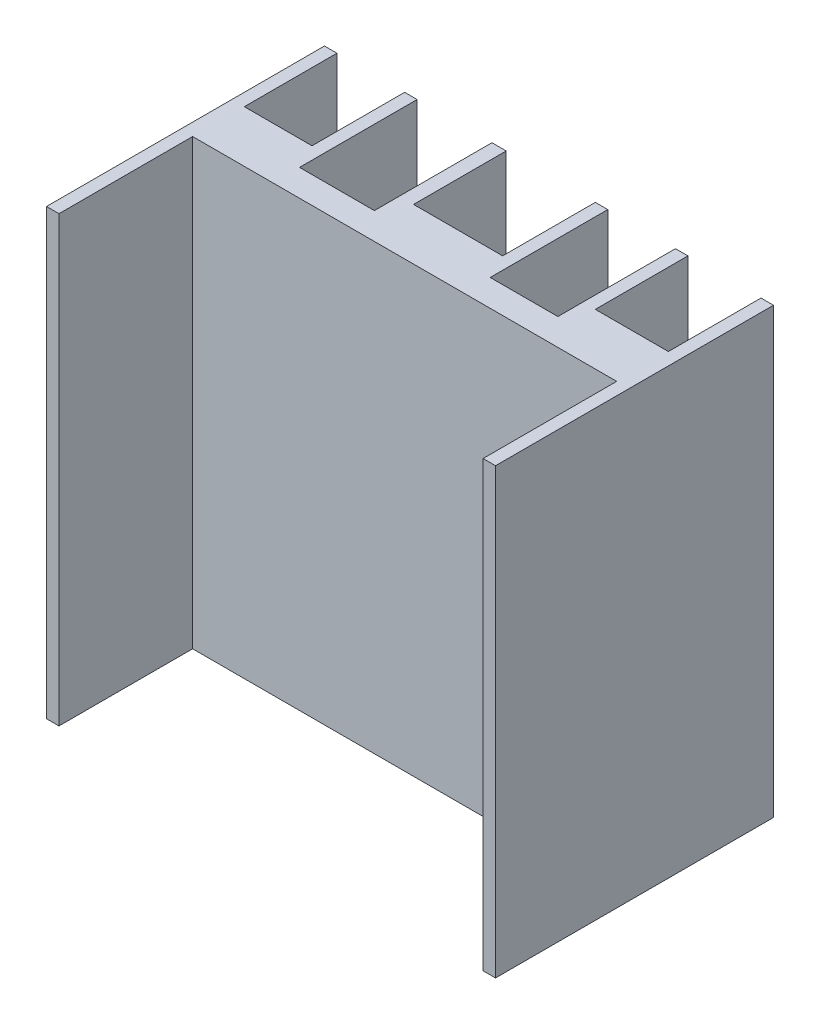
ISO-10303-21;
HEADER;
FILE_DESCRIPTION(('STEP AP214'),'2;1');
FILE_NAME('part.step','',(''),(''),'','','');
FILE_SCHEMA(('AUTOMOTIVE_DESIGN { 1 0 10303 214 1 1 1 1 }'));
ENDSEC;
DATA;
#1=APPLICATION_CONTEXT('core data for automotive mechanical design processes');
#2=APPLICATION_PROTOCOL_DEFINITION('international standard','automotive_design',2000,#1);
#3=PRODUCT_CONTEXT('',#1,'mechanical');
#4=PRODUCT('Part','Part','',(#3));
#5=PRODUCT_RELATED_PRODUCT_CATEGORY('part','',(#4));
#6=PRODUCT_DEFINITION_FORMATION('','',#4);
#7=PRODUCT_DEFINITION_CONTEXT('part definition',#1,'design');
#8=PRODUCT_DEFINITION('design','',#6,#7);
#9=PRODUCT_DEFINITION_SHAPE('','',#8);
#10=(LENGTH_UNIT() NAMED_UNIT(*) SI_UNIT(.MILLI.,.METRE.));
#11=(NAMED_UNIT(*) PLANE_ANGLE_UNIT() SI_UNIT($,.RADIAN.));
#12=(NAMED_UNIT(*) SI_UNIT($,.STERADIAN.) SOLID_ANGLE_UNIT());
#13=UNCERTAINTY_MEASURE_WITH_UNIT(LENGTH_MEASURE(1.E-05),#10,'distance_accuracy_value','');
#14=(GEOMETRIC_REPRESENTATION_CONTEXT(3) GLOBAL_UNCERTAINTY_ASSIGNED_CONTEXT((#13)) GLOBAL_UNIT_ASSIGNED_CONTEXT((#10,
#11,#12)) REPRESENTATION_CONTEXT('',''));
#15=CARTESIAN_POINT('',(0.,0.,0.));
#16=DIRECTION('',(0.,0.,1.));
#17=DIRECTION('',(1.,0.,0.));
#18=AXIS2_PLACEMENT_3D('',#15,#16,#17);
#19=CARTESIAN_POINT('',(2.6,24.9,-16.3));
#20=DIRECTION('',(1.,0.,0.));
#21=DIRECTION('',(0.,0.,-1.));
#22=AXIS2_PLACEMENT_3D('',#19,#20,#21);
#23=PLANE('',#22);
#24=DIRECTION('',(0.,0.,1.));
#25=VECTOR('',#24,1.);
#26=CARTESIAN_POINT('',(2.6,0.,-16.3));
#27=LINE('',#26,#25);
#28=CARTESIAN_POINT('',(2.6,0.,-21.5));
#29=VERTEX_POINT('',#28);
#30=CARTESIAN_POINT('',(2.6,0.,-16.3));
#31=VERTEX_POINT('',#30);
#32=EDGE_CURVE('E260',#29,#31,#27,.T.);
#33=ORIENTED_EDGE('',*,*,#32,.T.);
#34=DIRECTION('',(0.,-1.,0.));
#35=VECTOR('',#34,1.);
#36=CARTESIAN_POINT('',(2.6,24.9,-16.3));
#37=LINE('',#36,#35);
#38=CARTESIAN_POINT('',(2.6,24.9,-16.3));
#39=VERTEX_POINT('',#38);
#40=EDGE_CURVE('E11',#39,#31,#37,.T.);
#41=ORIENTED_EDGE('',*,*,#40,.F.);
#42=DIRECTION('',(0.,0.,1.));
#43=VECTOR('',#42,1.);
#44=CARTESIAN_POINT('',(2.6,24.9,-16.3));
#45=LINE('',#44,#43);
#46=CARTESIAN_POINT('',(2.6,24.9,-21.5));
#47=VERTEX_POINT('',#46);
#48=EDGE_CURVE('E342',#47,#39,#45,.T.);
#49=ORIENTED_EDGE('',*,*,#48,.F.);
#50=DIRECTION('',(0.,-1.,0.));
#51=VECTOR('',#50,1.);
#52=CARTESIAN_POINT('',(2.6,24.9,-21.5));
#53=LINE('',#52,#51);
#54=EDGE_CURVE('E256',#47,#29,#53,.T.);
#55=ORIENTED_EDGE('',*,*,#54,.T.);
#56=EDGE_LOOP('',(#33,#41,#49,#55));
#57=FACE_BOUND('',#56,.T.);
#58=ADVANCED_FACE('F39',(#57),#23,.F.);
#59=CARTESIAN_POINT('',(-2.4,24.9,-16.3));
#60=DIRECTION('',(0.,0.,1.));
#61=DIRECTION('',(1.,0.,0.));
#62=AXIS2_PLACEMENT_3D('',#59,#60,#61);
#63=PLANE('',#62);
#64=DIRECTION('',(-1.,0.,0.));
#65=VECTOR('',#64,1.);
#66=CARTESIAN_POINT('',(-2.4,0.,-16.3));
#67=LINE('',#66,#65);
#68=CARTESIAN_POINT('',(-2.4,0.,-16.3));
#69=VERTEX_POINT('',#68);
#70=EDGE_CURVE('E264',#31,#69,#67,.T.);
#71=ORIENTED_EDGE('',*,*,#70,.T.);
#72=DIRECTION('',(0.,-1.,0.));
#73=VECTOR('',#72,1.);
#74=CARTESIAN_POINT('',(-2.4,24.9,-16.3));
#75=LINE('',#74,#73);
#76=CARTESIAN_POINT('',(-2.4,24.9,-16.3));
#77=VERTEX_POINT('',#76);
#78=EDGE_CURVE('E48',#77,#69,#75,.T.);
#79=ORIENTED_EDGE('',*,*,#78,.F.);
#80=DIRECTION('',(-1.,0.,0.));
#81=VECTOR('',#80,1.);
#82=CARTESIAN_POINT('',(-2.4,24.9,-16.3));
#83=LINE('',#82,#81);
#84=EDGE_CURVE('E159',#39,#77,#83,.T.);
#85=ORIENTED_EDGE('',*,*,#84,.F.);
#86=ORIENTED_EDGE('',*,*,#40,.T.);
#87=EDGE_LOOP('',(#71,#79,#85,#86));
#88=FACE_BOUND('',#87,.T.);
#89=ADVANCED_FACE('F548',(#88),#63,.F.);
#90=CARTESIAN_POINT('',(-2.4,24.9,-21.5));
#91=DIRECTION('',(-1.,0.,0.));
#92=DIRECTION('',(0.,0.,1.));
#93=AXIS2_PLACEMENT_3D('',#90,#91,#92);
#94=PLANE('',#93);
#95=DIRECTION('',(0.,0.,-1.));
#96=VECTOR('',#95,1.);
#97=CARTESIAN_POINT('',(-2.4,0.,-21.5));
#98=LINE('',#97,#96);
#99=CARTESIAN_POINT('',(-2.4,0.,-21.5));
#100=VERTEX_POINT('',#99);
#101=EDGE_CURVE('E267',#69,#100,#98,.T.);
#102=ORIENTED_EDGE('',*,*,#101,.T.);
#103=DIRECTION('',(0.,-1.,0.));
#104=VECTOR('',#103,1.);
#105=CARTESIAN_POINT('',(-2.4,24.9,-21.5));
#106=LINE('',#105,#104);
#107=CARTESIAN_POINT('',(-2.4,24.9,-21.5));
#108=VERTEX_POINT('',#107);
#109=EDGE_CURVE('E433',#108,#100,#106,.T.);
#110=ORIENTED_EDGE('',*,*,#109,.F.);
#111=DIRECTION('',(0.,0.,-1.));
#112=VECTOR('',#111,1.);
#113=CARTESIAN_POINT('',(-2.4,24.9,-21.5));
#114=LINE('',#113,#112);
#115=EDGE_CURVE('E443',#77,#108,#114,.T.);
#116=ORIENTED_EDGE('',*,*,#115,.F.);
#117=ORIENTED_EDGE('',*,*,#78,.T.);
#118=EDGE_LOOP('',(#102,#110,#116,#117));
#119=FACE_BOUND('',#118,.T.);
#120=ADVANCED_FACE('F441',(#119),#94,.F.);
#121=CARTESIAN_POINT('',(-3.2,24.9,-21.5));
#122=DIRECTION('',(0.,0.,1.));
#123=DIRECTION('',(1.,0.,0.));
#124=AXIS2_PLACEMENT_3D('',#121,#122,#123);
#125=PLANE('',#124);
#126=DIRECTION('',(-1.,0.,0.));
#127=VECTOR('',#126,1.);
#128=CARTESIAN_POINT('',(-3.2,0.,-21.5));
#129=LINE('',#128,#127);
#130=CARTESIAN_POINT('',(-3.2,0.,-21.5));
#131=VERTEX_POINT('',#130);
#132=EDGE_CURVE('E270',#100,#131,#129,.T.);
#133=ORIENTED_EDGE('',*,*,#132,.T.);
#134=DIRECTION('',(0.,-1.,0.));
#135=VECTOR('',#134,1.);
#136=CARTESIAN_POINT('',(-3.2,24.9,-21.5));
#137=LINE('',#136,#135);
#138=CARTESIAN_POINT('',(-3.2,24.9,-21.5));
#139=VERTEX_POINT('',#138);
#140=EDGE_CURVE('E429',#139,#131,#137,.T.);
#141=ORIENTED_EDGE('',*,*,#140,.F.);
#142=DIRECTION('',(-1.,0.,0.));
#143=VECTOR('',#142,1.);
#144=CARTESIAN_POINT('',(-3.2,24.9,-21.5));
#145=LINE('',#144,#143);
#146=EDGE_CURVE('E462',#108,#139,#145,.T.);
#147=ORIENTED_EDGE('',*,*,#146,.F.);
#148=ORIENTED_EDGE('',*,*,#109,.T.);
#149=EDGE_LOOP('',(#133,#141,#147,#148));
#150=FACE_BOUND('',#149,.T.);
#151=ADVANCED_FACE('F452',(#150),#125,.F.);
#152=CARTESIAN_POINT('',(-3.2,24.9,-14.9));
#153=DIRECTION('',(1.,0.,0.));
#154=DIRECTION('',(0.,0.,-1.));
#155=AXIS2_PLACEMENT_3D('',#152,#153,#154);
#156=PLANE('',#155);
#157=DIRECTION('',(0.,0.,1.));
#158=VECTOR('',#157,1.);
#159=CARTESIAN_POINT('',(-3.2,0.,-14.9));
#160=LINE('',#159,#158);
#161=CARTESIAN_POINT('',(-3.2,0.,-14.9));
#162=VERTEX_POINT('',#161);
#163=EDGE_CURVE('E273',#131,#162,#160,.T.);
#164=ORIENTED_EDGE('',*,*,#163,.T.);
#165=DIRECTION('',(0.,-1.,0.));
#166=VECTOR('',#165,1.);
#167=CARTESIAN_POINT('',(-3.2,24.9,-14.9));
#168=LINE('',#167,#166);
#169=CARTESIAN_POINT('',(-3.2,24.9,-14.9));
#170=VERTEX_POINT('',#169);
#171=EDGE_CURVE('E425',#170,#162,#168,.T.);
#172=ORIENTED_EDGE('',*,*,#171,.F.);
#173=DIRECTION('',(0.,0.,1.));
#174=VECTOR('',#173,1.);
#175=CARTESIAN_POINT('',(-3.2,24.9,-14.9));
#176=LINE('',#175,#174);
#177=EDGE_CURVE('E458',#139,#170,#176,.T.);
#178=ORIENTED_EDGE('',*,*,#177,.F.);
#179=ORIENTED_EDGE('',*,*,#140,.T.);
#180=EDGE_LOOP('',(#164,#172,#178,#179));
#181=FACE_BOUND('',#180,.T.);
#182=ADVANCED_FACE('F456',(#181),#156,.F.);
#183=CARTESIAN_POINT('',(-7.4,24.9,-14.9));
#184=DIRECTION('',(0.,0.,1.));
#185=DIRECTION('',(1.,0.,0.));
#186=AXIS2_PLACEMENT_3D('',#183,#184,#185);
#187=PLANE('',#186);
#188=DIRECTION('',(-1.,0.,0.));
#189=VECTOR('',#188,1.);
#190=CARTESIAN_POINT('',(-7.4,0.,-14.9));
#191=LINE('',#190,#189);
#192=CARTESIAN_POINT('',(-7.4,0.,-14.9));
#193=VERTEX_POINT('',#192);
#194=EDGE_CURVE('E276',#162,#193,#191,.T.);
#195=ORIENTED_EDGE('',*,*,#194,.T.);
#196=DIRECTION('',(0.,-1.,0.));
#197=VECTOR('',#196,1.);
#198=CARTESIAN_POINT('',(-7.4,24.9,-14.9));
#199=LINE('',#198,#197);
#200=CARTESIAN_POINT('',(-7.4,24.9,-14.9));
#201=VERTEX_POINT('',#200);
#202=EDGE_CURVE('E421',#201,#193,#199,.T.);
#203=ORIENTED_EDGE('',*,*,#202,.F.);
#204=DIRECTION('',(-1.,0.,0.));
#205=VECTOR('',#204,1.);
#206=CARTESIAN_POINT('',(-7.4,24.9,-14.9));
#207=LINE('',#206,#205);
#208=EDGE_CURVE('E461',#170,#201,#207,.T.);
#209=ORIENTED_EDGE('',*,*,#208,.F.);
#210=ORIENTED_EDGE('',*,*,#171,.T.);
#211=EDGE_LOOP('',(#195,#203,#209,#210));
#212=FACE_BOUND('',#211,.T.);
#213=ADVANCED_FACE('F561',(#212),#187,.F.);
#214=CARTESIAN_POINT('',(-7.4,24.9,-21.5));
#215=DIRECTION('',(-1.,0.,0.));
#216=DIRECTION('',(0.,0.,1.));
#217=AXIS2_PLACEMENT_3D('',#214,#215,#216);
#218=PLANE('',#217);
#219=DIRECTION('',(0.,0.,-1.));
#220=VECTOR('',#219,1.);
#221=CARTESIAN_POINT('',(-7.4,0.,-21.5));
#222=LINE('',#221,#220);
#223=CARTESIAN_POINT('',(-7.4,0.,-21.5));
#224=VERTEX_POINT('',#223);
#225=EDGE_CURVE('E279',#193,#224,#222,.T.);
#226=ORIENTED_EDGE('',*,*,#225,.T.);
#227=DIRECTION('',(0.,-1.,0.));
#228=VECTOR('',#227,1.);
#229=CARTESIAN_POINT('',(-7.4,24.9,-21.5));
#230=LINE('',#229,#228);
#231=CARTESIAN_POINT('',(-7.4,24.9,-21.5));
#232=VERTEX_POINT('',#231);
#233=EDGE_CURVE('E417',#232,#224,#230,.T.);
#234=ORIENTED_EDGE('',*,*,#233,.F.);
#235=DIRECTION('',(0.,0.,-1.));
#236=VECTOR('',#235,1.);
#237=CARTESIAN_POINT('',(-7.4,24.9,-21.5));
#238=LINE('',#237,#236);
#239=EDGE_CURVE('E466',#201,#232,#238,.T.);
#240=ORIENTED_EDGE('',*,*,#239,.F.);
#241=ORIENTED_EDGE('',*,*,#202,.T.);
#242=EDGE_LOOP('',(#226,#234,#240,#241));
#243=FACE_BOUND('',#242,.T.);
#244=ADVANCED_FACE('F564',(#243),#218,.F.);
#245=CARTESIAN_POINT('',(-8.1,24.9,-21.5));
#246=DIRECTION('',(0.,0.,1.));
#247=DIRECTION('',(1.,0.,0.));
#248=AXIS2_PLACEMENT_3D('',#245,#246,#247);
#249=PLANE('',#248);
#250=DIRECTION('',(-1.,0.,0.));
#251=VECTOR('',#250,1.);
#252=CARTESIAN_POINT('',(-8.1,0.,-21.5));
#253=LINE('',#252,#251);
#254=CARTESIAN_POINT('',(-8.1,0.,-21.5));
#255=VERTEX_POINT('',#254);
#256=EDGE_CURVE('E282',#224,#255,#253,.T.);
#257=ORIENTED_EDGE('',*,*,#256,.T.);
#258=DIRECTION('',(0.,-1.,0.));
#259=VECTOR('',#258,1.);
#260=CARTESIAN_POINT('',(-8.1,24.9,-21.5));
#261=LINE('',#260,#259);
#262=CARTESIAN_POINT('',(-8.1,24.9,-21.5));
#263=VERTEX_POINT('',#262);
#264=EDGE_CURVE('E413',#263,#255,#261,.T.);
#265=ORIENTED_EDGE('',*,*,#264,.F.);
#266=DIRECTION('',(-1.,0.,0.));
#267=VECTOR('',#266,1.);
#268=CARTESIAN_POINT('',(-8.1,24.9,-21.5));
#269=LINE('',#268,#267);
#270=EDGE_CURVE('E473',#232,#263,#269,.T.);
#271=ORIENTED_EDGE('',*,*,#270,.F.);
#272=ORIENTED_EDGE('',*,*,#233,.T.);
#273=EDGE_LOOP('',(#257,#265,#271,#272));
#274=FACE_BOUND('',#273,.T.);
#275=ADVANCED_FACE('F568',(#274),#249,.F.);
#276=CARTESIAN_POINT('',(-8.1,24.9,-16.3));
#277=DIRECTION('',(1.,0.,0.));
#278=DIRECTION('',(0.,0.,-1.));
#279=AXIS2_PLACEMENT_3D('',#276,#277,#278);
#280=PLANE('',#279);
#281=DIRECTION('',(0.,0.,1.));
#282=VECTOR('',#281,1.);
#283=CARTESIAN_POINT('',(-8.1,0.,-16.3));
#284=LINE('',#283,#282);
#285=CARTESIAN_POINT('',(-8.1,0.,-16.3));
#286=VERTEX_POINT('',#285);
#287=EDGE_CURVE('E285',#255,#286,#284,.T.);
#288=ORIENTED_EDGE('',*,*,#287,.T.);
#289=DIRECTION('',(0.,-1.,0.));
#290=VECTOR('',#289,1.);
#291=CARTESIAN_POINT('',(-8.1,24.9,-16.3));
#292=LINE('',#291,#290);
#293=CARTESIAN_POINT('',(-8.1,24.9,-16.3));
#294=VERTEX_POINT('',#293);
#295=EDGE_CURVE('E409',#294,#286,#292,.T.);
#296=ORIENTED_EDGE('',*,*,#295,.F.);
#297=DIRECTION('',(0.,0.,1.));
#298=VECTOR('',#297,1.);
#299=CARTESIAN_POINT('',(-8.1,24.9,-16.3));
#300=LINE('',#299,#298);
#301=EDGE_CURVE('E476',#263,#294,#300,.T.);
#302=ORIENTED_EDGE('',*,*,#301,.F.);
#303=ORIENTED_EDGE('',*,*,#264,.T.);
#304=EDGE_LOOP('',(#288,#296,#302,#303));
#305=FACE_BOUND('',#304,.T.);
#306=ADVANCED_FACE('F572',(#305),#280,.F.);
#307=CARTESIAN_POINT('',(-11.9,24.9,-16.3));
#308=DIRECTION('',(0.,0.,1.));
#309=DIRECTION('',(1.,0.,0.));
#310=AXIS2_PLACEMENT_3D('',#307,#308,#309);
#311=PLANE('',#310);
#312=DIRECTION('',(-1.,0.,0.));
#313=VECTOR('',#312,1.);
#314=CARTESIAN_POINT('',(-11.9,0.,-16.3));
#315=LINE('',#314,#313);
#316=CARTESIAN_POINT('',(-11.9,0.,-16.3));
#317=VERTEX_POINT('',#316);
#318=EDGE_CURVE('E288',#286,#317,#315,.T.);
#319=ORIENTED_EDGE('',*,*,#318,.T.);
#320=DIRECTION('',(0.,-1.,0.));
#321=VECTOR('',#320,1.);
#322=CARTESIAN_POINT('',(-11.9,24.9,-16.3));
#323=LINE('',#322,#321);
#324=CARTESIAN_POINT('',(-11.9,24.9,-16.3));
#325=VERTEX_POINT('',#324);
#326=EDGE_CURVE('E405',#325,#317,#323,.T.);
#327=ORIENTED_EDGE('',*,*,#326,.F.);
#328=DIRECTION('',(-1.,0.,0.));
#329=VECTOR('',#328,1.);
#330=CARTESIAN_POINT('',(-11.9,24.9,-16.3));
#331=LINE('',#330,#329);
#332=EDGE_CURVE('E479',#294,#325,#331,.T.);
#333=ORIENTED_EDGE('',*,*,#332,.F.);
#334=ORIENTED_EDGE('',*,*,#295,.T.);
#335=EDGE_LOOP('',(#319,#327,#333,#334));
#336=FACE_BOUND('',#335,.T.);
#337=ADVANCED_FACE('F576',(#336),#311,.F.);
#338=CARTESIAN_POINT('',(-11.9,24.9,-21.5));
#339=DIRECTION('',(-1.,0.,0.));
#340=DIRECTION('',(0.,0.,1.));
#341=AXIS2_PLACEMENT_3D('',#338,#339,#340);
#342=PLANE('',#341);
#343=DIRECTION('',(0.,0.,-1.));
#344=VECTOR('',#343,1.);
#345=CARTESIAN_POINT('',(-11.9,0.,-21.5));
#346=LINE('',#345,#344);
#347=CARTESIAN_POINT('',(-11.9,0.,-21.5));
#348=VERTEX_POINT('',#347);
#349=EDGE_CURVE('E291',#317,#348,#346,.T.);
#350=ORIENTED_EDGE('',*,*,#349,.T.);
#351=DIRECTION('',(0.,-1.,0.));
#352=VECTOR('',#351,1.);
#353=CARTESIAN_POINT('',(-11.9,24.9,-21.5));
#354=LINE('',#353,#352);
#355=CARTESIAN_POINT('',(-11.9,24.9,-21.5));
#356=VERTEX_POINT('',#355);
#357=EDGE_CURVE('E401',#356,#348,#354,.T.);
#358=ORIENTED_EDGE('',*,*,#357,.F.);
#359=DIRECTION('',(0.,0.,-1.));
#360=VECTOR('',#359,1.);
#361=CARTESIAN_POINT('',(-11.9,24.9,-21.5));
#362=LINE('',#361,#360);
#363=EDGE_CURVE('E482',#325,#356,#362,.T.);
#364=ORIENTED_EDGE('',*,*,#363,.F.);
#365=ORIENTED_EDGE('',*,*,#326,.T.);
#366=EDGE_LOOP('',(#350,#358,#364,#365));
#367=FACE_BOUND('',#366,.T.);
#368=ADVANCED_FACE('F580',(#367),#342,.F.);
#369=CARTESIAN_POINT('',(-12.6,24.9,-21.5));
#370=DIRECTION('',(0.,0.,1.));
#371=DIRECTION('',(1.,0.,0.));
#372=AXIS2_PLACEMENT_3D('',#369,#370,#371);
#373=PLANE('',#372);
#374=DIRECTION('',(-1.,0.,0.));
#375=VECTOR('',#374,1.);
#376=CARTESIAN_POINT('',(-12.6,0.,-21.5));
#377=LINE('',#376,#375);
#378=CARTESIAN_POINT('',(-12.6,0.,-21.5));
#379=VERTEX_POINT('',#378);
#380=EDGE_CURVE('E294',#348,#379,#377,.T.);
#381=ORIENTED_EDGE('',*,*,#380,.T.);
#382=DIRECTION('',(0.,-1.,0.));
#383=VECTOR('',#382,1.);
#384=CARTESIAN_POINT('',(-12.6,24.9,-21.5));
#385=LINE('',#384,#383);
#386=CARTESIAN_POINT('',(-12.6,24.9,-21.5));
#387=VERTEX_POINT('',#386);
#388=EDGE_CURVE('E397',#387,#379,#385,.T.);
#389=ORIENTED_EDGE('',*,*,#388,.F.);
#390=DIRECTION('',(-1.,0.,0.));
#391=VECTOR('',#390,1.);
#392=CARTESIAN_POINT('',(-12.6,24.9,-21.5));
#393=LINE('',#392,#391);
#394=EDGE_CURVE('E485',#356,#387,#393,.T.);
#395=ORIENTED_EDGE('',*,*,#394,.F.);
#396=ORIENTED_EDGE('',*,*,#357,.T.);
#397=EDGE_LOOP('',(#381,#389,#395,#396));
#398=FACE_BOUND('',#397,.T.);
#399=ADVANCED_FACE('F584',(#398),#373,.F.);
#400=CARTESIAN_POINT('',(-12.6,24.9,-21.5));
#401=DIRECTION('',(1.,0.,0.));
#402=DIRECTION('',(0.,0.,-1.));
#403=AXIS2_PLACEMENT_3D('',#400,#401,#402);
#404=PLANE('',#403);
#405=DIRECTION('',(0.,0.,1.));
#406=VECTOR('',#405,1.);
#407=CARTESIAN_POINT('',(-12.6,0.,-21.5));
#408=LINE('',#407,#406);
#409=CARTESIAN_POINT('',(-12.6,0.,-5.9));
#410=VERTEX_POINT('',#409);
#411=EDGE_CURVE('E297',#379,#410,#408,.T.);
#412=ORIENTED_EDGE('',*,*,#411,.T.);
#413=DIRECTION('',(0.,-1.,0.));
#414=VECTOR('',#413,1.);
#415=CARTESIAN_POINT('',(-12.6,24.9,-5.9));
#416=LINE('',#415,#414);
#417=CARTESIAN_POINT('',(-12.6,24.9,-5.9));
#418=VERTEX_POINT('',#417);
#419=EDGE_CURVE('E393',#418,#410,#416,.T.);
#420=ORIENTED_EDGE('',*,*,#419,.F.);
#421=DIRECTION('',(0.,0.,1.));
#422=VECTOR('',#421,1.);
#423=CARTESIAN_POINT('',(-12.6,24.9,-21.5));
#424=LINE('',#423,#422);
#425=EDGE_CURVE('E488',#387,#418,#424,.T.);
#426=ORIENTED_EDGE('',*,*,#425,.F.);
#427=ORIENTED_EDGE('',*,*,#388,.T.);
#428=EDGE_LOOP('',(#412,#420,#426,#427));
#429=FACE_BOUND('',#428,.T.);
#430=ADVANCED_FACE('F588',(#429),#404,.F.);
#431=CARTESIAN_POINT('',(-11.9,24.9,-5.9));
#432=DIRECTION('',(0.,0.,-1.));
#433=DIRECTION('',(-1.,0.,0.));
#434=AXIS2_PLACEMENT_3D('',#431,#432,#433);
#435=PLANE('',#434);
#436=DIRECTION('',(1.,0.,0.));
#437=VECTOR('',#436,1.);
#438=CARTESIAN_POINT('',(-11.9,0.,-5.9));
#439=LINE('',#438,#437);
#440=CARTESIAN_POINT('',(-11.9,0.,-5.9));
#441=VERTEX_POINT('',#440);
#442=EDGE_CURVE('E300',#410,#441,#439,.T.);
#443=ORIENTED_EDGE('',*,*,#442,.T.);
#444=DIRECTION('',(0.,-1.,0.));
#445=VECTOR('',#444,1.);
#446=CARTESIAN_POINT('',(-11.9,24.9,-5.9));
#447=LINE('',#446,#445);
#448=CARTESIAN_POINT('',(-11.9,24.9,-5.9));
#449=VERTEX_POINT('',#448);
#450=EDGE_CURVE('E389',#449,#441,#447,.T.);
#451=ORIENTED_EDGE('',*,*,#450,.F.);
#452=DIRECTION('',(1.,0.,0.));
#453=VECTOR('',#452,1.);
#454=CARTESIAN_POINT('',(-11.9,24.9,-5.9));
#455=LINE('',#454,#453);
#456=EDGE_CURVE('E491',#418,#449,#455,.T.);
#457=ORIENTED_EDGE('',*,*,#456,.F.);
#458=ORIENTED_EDGE('',*,*,#419,.T.);
#459=EDGE_LOOP('',(#443,#451,#457,#458));
#460=FACE_BOUND('',#459,.T.);
#461=ADVANCED_FACE('F592',(#460),#435,.F.);
#462=CARTESIAN_POINT('',(-11.9,24.9,-5.9));
#463=DIRECTION('',(-1.,0.,0.));
#464=DIRECTION('',(0.,0.,1.));
#465=AXIS2_PLACEMENT_3D('',#462,#463,#464);
#466=PLANE('',#465);
#467=DIRECTION('',(0.,0.,-1.));
#468=VECTOR('',#467,1.);
#469=CARTESIAN_POINT('',(-11.9,0.,-5.9));
#470=LINE('',#469,#468);
#471=CARTESIAN_POINT('',(-11.9,0.,-13.4));
#472=VERTEX_POINT('',#471);
#473=EDGE_CURVE('E303',#441,#472,#470,.T.);
#474=ORIENTED_EDGE('',*,*,#473,.T.);
#475=DIRECTION('',(0.,-1.,0.));
#476=VECTOR('',#475,1.);
#477=CARTESIAN_POINT('',(-11.9,24.9,-13.4));
#478=LINE('',#477,#476);
#479=CARTESIAN_POINT('',(-11.9,24.9,-13.4));
#480=VERTEX_POINT('',#479);
#481=EDGE_CURVE('E385',#480,#472,#478,.T.);
#482=ORIENTED_EDGE('',*,*,#481,.F.);
#483=DIRECTION('',(0.,0.,-1.));
#484=VECTOR('',#483,1.);
#485=CARTESIAN_POINT('',(-11.9,24.9,-5.9));
#486=LINE('',#485,#484);
#487=EDGE_CURVE('E494',#449,#480,#486,.T.);
#488=ORIENTED_EDGE('',*,*,#487,.F.);
#489=ORIENTED_EDGE('',*,*,#450,.T.);
#490=EDGE_LOOP('',(#474,#482,#488,#489));
#491=FACE_BOUND('',#490,.T.);
#492=ADVANCED_FACE('F596',(#491),#466,.F.);
#493=CARTESIAN_POINT('',(-11.9,24.9,-13.4));
#494=DIRECTION('',(0.,0.,-1.));
#495=DIRECTION('',(-1.,0.,0.));
#496=AXIS2_PLACEMENT_3D('',#493,#494,#495);
#497=PLANE('',#496);
#498=DIRECTION('',(1.,0.,0.));
#499=VECTOR('',#498,1.);
#500=CARTESIAN_POINT('',(-11.9,0.,-13.4));
#501=LINE('',#500,#499);
#502=CARTESIAN_POINT('',(11.9,0.,-13.4));
#503=VERTEX_POINT('',#502);
#504=EDGE_CURVE('E306',#472,#503,#501,.T.);
#505=ORIENTED_EDGE('',*,*,#504,.T.);
#506=DIRECTION('',(0.,-1.,0.));
#507=VECTOR('',#506,1.);
#508=CARTESIAN_POINT('',(11.9,24.9,-13.4));
#509=LINE('',#508,#507);
#510=CARTESIAN_POINT('',(11.9,24.9,-13.4));
#511=VERTEX_POINT('',#510);
#512=EDGE_CURVE('E381',#511,#503,#509,.T.);
#513=ORIENTED_EDGE('',*,*,#512,.F.);
#514=DIRECTION('',(1.,0.,0.));
#515=VECTOR('',#514,1.);
#516=CARTESIAN_POINT('',(-11.9,24.9,-13.4));
#517=LINE('',#516,#515);
#518=EDGE_CURVE('E497',#480,#511,#517,.T.);
#519=ORIENTED_EDGE('',*,*,#518,.F.);
#520=ORIENTED_EDGE('',*,*,#481,.T.);
#521=EDGE_LOOP('',(#505,#513,#519,#520));
#522=FACE_BOUND('',#521,.T.);
#523=ADVANCED_FACE('F600',(#522),#497,.F.);
#524=CARTESIAN_POINT('',(11.9,24.9,-13.4));
#525=DIRECTION('',(1.,0.,0.));
#526=DIRECTION('',(0.,0.,-1.));
#527=AXIS2_PLACEMENT_3D('',#524,#525,#526);
#528=PLANE('',#527);
#529=DIRECTION('',(0.,0.,1.));
#530=VECTOR('',#529,1.);
#531=CARTESIAN_POINT('',(11.9,0.,-13.4));
#532=LINE('',#531,#530);
#533=CARTESIAN_POINT('',(11.9,0.,-5.9));
#534=VERTEX_POINT('',#533);
#535=EDGE_CURVE('E309',#503,#534,#532,.T.);
#536=ORIENTED_EDGE('',*,*,#535,.T.);
#537=DIRECTION('',(0.,-1.,0.));
#538=VECTOR('',#537,1.);
#539=CARTESIAN_POINT('',(11.9,24.9,-5.9));
#540=LINE('',#539,#538);
#541=CARTESIAN_POINT('',(11.9,24.9,-5.9));
#542=VERTEX_POINT('',#541);
#543=EDGE_CURVE('E377',#542,#534,#540,.T.);
#544=ORIENTED_EDGE('',*,*,#543,.F.);
#545=DIRECTION('',(0.,0.,1.));
#546=VECTOR('',#545,1.);
#547=CARTESIAN_POINT('',(11.9,24.9,-13.4));
#548=LINE('',#547,#546);
#549=EDGE_CURVE('E500',#511,#542,#548,.T.);
#550=ORIENTED_EDGE('',*,*,#549,.F.);
#551=ORIENTED_EDGE('',*,*,#512,.T.);
#552=EDGE_LOOP('',(#536,#544,#550,#551));
#553=FACE_BOUND('',#552,.T.);
#554=ADVANCED_FACE('F604',(#553),#528,.F.);
#555=CARTESIAN_POINT('',(11.9,24.9,-5.9));
#556=DIRECTION('',(0.,0.,-1.));
#557=DIRECTION('',(-1.,0.,0.));
#558=AXIS2_PLACEMENT_3D('',#555,#556,#557);
#559=PLANE('',#558);
#560=DIRECTION('',(1.,0.,0.));
#561=VECTOR('',#560,1.);
#562=CARTESIAN_POINT('',(11.9,0.,-5.9));
#563=LINE('',#562,#561);
#564=CARTESIAN_POINT('',(12.6,0.,-5.9));
#565=VERTEX_POINT('',#564);
#566=EDGE_CURVE('E312',#534,#565,#563,.T.);
#567=ORIENTED_EDGE('',*,*,#566,.T.);
#568=DIRECTION('',(0.,-1.,0.));
#569=VECTOR('',#568,1.);
#570=CARTESIAN_POINT('',(12.6,24.9,-5.9));
#571=LINE('',#570,#569);
#572=CARTESIAN_POINT('',(12.6,24.9,-5.9));
#573=VERTEX_POINT('',#572);
#574=EDGE_CURVE('E373',#573,#565,#571,.T.);
#575=ORIENTED_EDGE('',*,*,#574,.F.);
#576=DIRECTION('',(1.,0.,0.));
#577=VECTOR('',#576,1.);
#578=CARTESIAN_POINT('',(11.9,24.9,-5.9));
#579=LINE('',#578,#577);
#580=EDGE_CURVE('E503',#542,#573,#579,.T.);
#581=ORIENTED_EDGE('',*,*,#580,.F.);
#582=ORIENTED_EDGE('',*,*,#543,.T.);
#583=EDGE_LOOP('',(#567,#575,#581,#582));
#584=FACE_BOUND('',#583,.T.);
#585=ADVANCED_FACE('F608',(#584),#559,.F.);
#586=CARTESIAN_POINT('',(12.6,24.9,-5.9));
#587=DIRECTION('',(-1.,0.,0.));
#588=DIRECTION('',(0.,0.,1.));
#589=AXIS2_PLACEMENT_3D('',#586,#587,#588);
#590=PLANE('',#589);
#591=DIRECTION('',(0.,0.,-1.));
#592=VECTOR('',#591,1.);
#593=CARTESIAN_POINT('',(12.6,0.,-5.9));
#594=LINE('',#593,#592);
#595=CARTESIAN_POINT('',(12.6,0.,-21.5));
#596=VERTEX_POINT('',#595);
#597=EDGE_CURVE('E315',#565,#596,#594,.T.);
#598=ORIENTED_EDGE('',*,*,#597,.T.);
#599=DIRECTION('',(0.,-1.,0.));
#600=VECTOR('',#599,1.);
#601=CARTESIAN_POINT('',(12.6,24.9,-21.5));
#602=LINE('',#601,#600);
#603=CARTESIAN_POINT('',(12.6,24.9,-21.5));
#604=VERTEX_POINT('',#603);
#605=EDGE_CURVE('E369',#604,#596,#602,.T.);
#606=ORIENTED_EDGE('',*,*,#605,.F.);
#607=DIRECTION('',(0.,0.,-1.));
#608=VECTOR('',#607,1.);
#609=CARTESIAN_POINT('',(12.6,24.9,-5.9));
#610=LINE('',#609,#608);
#611=EDGE_CURVE('E506',#573,#604,#610,.T.);
#612=ORIENTED_EDGE('',*,*,#611,.F.);
#613=ORIENTED_EDGE('',*,*,#574,.T.);
#614=EDGE_LOOP('',(#598,#606,#612,#613));
#615=FACE_BOUND('',#614,.T.);
#616=ADVANCED_FACE('F612',(#615),#590,.F.);
#617=CARTESIAN_POINT('',(11.9,24.9,-21.5));
#618=DIRECTION('',(0.,0.,1.));
#619=DIRECTION('',(1.,0.,0.));
#620=AXIS2_PLACEMENT_3D('',#617,#618,#619);
#621=PLANE('',#620);
#622=DIRECTION('',(-1.,0.,0.));
#623=VECTOR('',#622,1.);
#624=CARTESIAN_POINT('',(11.9,0.,-21.5));
#625=LINE('',#624,#623);
#626=CARTESIAN_POINT('',(11.9,0.,-21.5));
#627=VERTEX_POINT('',#626);
#628=EDGE_CURVE('E318',#596,#627,#625,.T.);
#629=ORIENTED_EDGE('',*,*,#628,.T.);
#630=DIRECTION('',(0.,-1.,0.));
#631=VECTOR('',#630,1.);
#632=CARTESIAN_POINT('',(11.9,24.9,-21.5));
#633=LINE('',#632,#631);
#634=CARTESIAN_POINT('',(11.9,24.9,-21.5));
#635=VERTEX_POINT('',#634);
#636=EDGE_CURVE('E365',#635,#627,#633,.T.);
#637=ORIENTED_EDGE('',*,*,#636,.F.);
#638=DIRECTION('',(-1.,0.,0.));
#639=VECTOR('',#638,1.);
#640=CARTESIAN_POINT('',(11.9,24.9,-21.5));
#641=LINE('',#640,#639);
#642=EDGE_CURVE('E509',#604,#635,#641,.T.);
#643=ORIENTED_EDGE('',*,*,#642,.F.);
#644=ORIENTED_EDGE('',*,*,#605,.T.);
#645=EDGE_LOOP('',(#629,#637,#643,#644));
#646=FACE_BOUND('',#645,.T.);
#647=ADVANCED_FACE('F616',(#646),#621,.F.);
#648=CARTESIAN_POINT('',(11.9,24.9,-16.3));
#649=DIRECTION('',(1.,0.,0.));
#650=DIRECTION('',(0.,0.,-1.));
#651=AXIS2_PLACEMENT_3D('',#648,#649,#650);
#652=PLANE('',#651);
#653=DIRECTION('',(0.,0.,1.));
#654=VECTOR('',#653,1.);
#655=CARTESIAN_POINT('',(11.9,0.,-16.3));
#656=LINE('',#655,#654);
#657=CARTESIAN_POINT('',(11.9,0.,-16.3));
#658=VERTEX_POINT('',#657);
#659=EDGE_CURVE('E321',#627,#658,#656,.T.);
#660=ORIENTED_EDGE('',*,*,#659,.T.);
#661=DIRECTION('',(0.,-1.,0.));
#662=VECTOR('',#661,1.);
#663=CARTESIAN_POINT('',(11.9,24.9,-16.3));
#664=LINE('',#663,#662);
#665=CARTESIAN_POINT('',(11.9,24.9,-16.3));
#666=VERTEX_POINT('',#665);
#667=EDGE_CURVE('E361',#666,#658,#664,.T.);
#668=ORIENTED_EDGE('',*,*,#667,.F.);
#669=DIRECTION('',(0.,0.,1.));
#670=VECTOR('',#669,1.);
#671=CARTESIAN_POINT('',(11.9,24.9,-16.3));
#672=LINE('',#671,#670);
#673=EDGE_CURVE('E512',#635,#666,#672,.T.);
#674=ORIENTED_EDGE('',*,*,#673,.F.);
#675=ORIENTED_EDGE('',*,*,#636,.T.);
#676=EDGE_LOOP('',(#660,#668,#674,#675));
#677=FACE_BOUND('',#676,.T.);
#678=ADVANCED_FACE('F620',(#677),#652,.F.);
#679=CARTESIAN_POINT('',(11.9,24.9,-16.3));
#680=DIRECTION('',(0.,0.,1.));
#681=DIRECTION('',(1.,0.,0.));
#682=AXIS2_PLACEMENT_3D('',#679,#680,#681);
#683=PLANE('',#682);
#684=DIRECTION('',(-1.,0.,0.));
#685=VECTOR('',#684,1.);
#686=CARTESIAN_POINT('',(11.9,0.,-16.3));
#687=LINE('',#686,#685);
#688=CARTESIAN_POINT('',(7.8,0.,-16.3));
#689=VERTEX_POINT('',#688);
#690=EDGE_CURVE('E324',#658,#689,#687,.T.);
#691=ORIENTED_EDGE('',*,*,#690,.T.);
#692=DIRECTION('',(0.,-1.,0.));
#693=VECTOR('',#692,1.);
#694=CARTESIAN_POINT('',(7.8,24.9,-16.3));
#695=LINE('',#694,#693);
#696=CARTESIAN_POINT('',(7.8,24.9,-16.3));
#697=VERTEX_POINT('',#696);
#698=EDGE_CURVE('E357',#697,#689,#695,.T.);
#699=ORIENTED_EDGE('',*,*,#698,.F.);
#700=DIRECTION('',(-1.,0.,0.));
#701=VECTOR('',#700,1.);
#702=CARTESIAN_POINT('',(11.9,24.9,-16.3));
#703=LINE('',#702,#701);
#704=EDGE_CURVE('E515',#666,#697,#703,.T.);
#705=ORIENTED_EDGE('',*,*,#704,.F.);
#706=ORIENTED_EDGE('',*,*,#667,.T.);
#707=EDGE_LOOP('',(#691,#699,#705,#706));
#708=FACE_BOUND('',#707,.T.);
#709=ADVANCED_FACE('F624',(#708),#683,.F.);
#710=CARTESIAN_POINT('',(7.8,24.9,-21.5));
#711=DIRECTION('',(-1.,0.,0.));
#712=DIRECTION('',(0.,0.,1.));
#713=AXIS2_PLACEMENT_3D('',#710,#711,#712);
#714=PLANE('',#713);
#715=DIRECTION('',(0.,0.,-1.));
#716=VECTOR('',#715,1.);
#717=CARTESIAN_POINT('',(7.8,0.,-21.5));
#718=LINE('',#717,#716);
#719=CARTESIAN_POINT('',(7.8,0.,-21.5));
#720=VERTEX_POINT('',#719);
#721=EDGE_CURVE('E327',#689,#720,#718,.T.);
#722=ORIENTED_EDGE('',*,*,#721,.T.);
#723=DIRECTION('',(0.,-1.,0.));
#724=VECTOR('',#723,1.);
#725=CARTESIAN_POINT('',(7.8,24.9,-21.5));
#726=LINE('',#725,#724);
#727=CARTESIAN_POINT('',(7.8,24.9,-21.5));
#728=VERTEX_POINT('',#727);
#729=EDGE_CURVE('E353',#728,#720,#726,.T.);
#730=ORIENTED_EDGE('',*,*,#729,.F.);
#731=DIRECTION('',(0.,0.,-1.));
#732=VECTOR('',#731,1.);
#733=CARTESIAN_POINT('',(7.8,24.9,-21.5));
#734=LINE('',#733,#732);
#735=EDGE_CURVE('E518',#697,#728,#734,.T.);
#736=ORIENTED_EDGE('',*,*,#735,.F.);
#737=ORIENTED_EDGE('',*,*,#698,.T.);
#738=EDGE_LOOP('',(#722,#730,#736,#737));
#739=FACE_BOUND('',#738,.T.);
#740=ADVANCED_FACE('F628',(#739),#714,.F.);
#741=CARTESIAN_POINT('',(7.1,24.9,-21.5));
#742=DIRECTION('',(0.,0.,1.));
#743=DIRECTION('',(1.,0.,0.));
#744=AXIS2_PLACEMENT_3D('',#741,#742,#743);
#745=PLANE('',#744);
#746=DIRECTION('',(-1.,0.,0.));
#747=VECTOR('',#746,1.);
#748=CARTESIAN_POINT('',(7.1,0.,-21.5));
#749=LINE('',#748,#747);
#750=CARTESIAN_POINT('',(7.1,0.,-21.5));
#751=VERTEX_POINT('',#750);
#752=EDGE_CURVE('E330',#720,#751,#749,.T.);
#753=ORIENTED_EDGE('',*,*,#752,.T.);
#754=DIRECTION('',(0.,-1.,0.));
#755=VECTOR('',#754,1.);
#756=CARTESIAN_POINT('',(7.1,24.9,-21.5));
#757=LINE('',#756,#755);
#758=CARTESIAN_POINT('',(7.1,24.9,-21.5));
#759=VERTEX_POINT('',#758);
#760=EDGE_CURVE('E349',#759,#751,#757,.T.);
#761=ORIENTED_EDGE('',*,*,#760,.F.);
#762=DIRECTION('',(-1.,0.,0.));
#763=VECTOR('',#762,1.);
#764=CARTESIAN_POINT('',(7.1,24.9,-21.5));
#765=LINE('',#764,#763);
#766=EDGE_CURVE('E521',#728,#759,#765,.T.);
#767=ORIENTED_EDGE('',*,*,#766,.F.);
#768=ORIENTED_EDGE('',*,*,#729,.T.);
#769=EDGE_LOOP('',(#753,#761,#767,#768));
#770=FACE_BOUND('',#769,.T.);
#771=ADVANCED_FACE('F529',(#770),#745,.F.);
#772=CARTESIAN_POINT('',(7.1,24.9,-14.9));
#773=DIRECTION('',(1.,0.,0.));
#774=DIRECTION('',(0.,0.,-1.));
#775=AXIS2_PLACEMENT_3D('',#772,#773,#774);
#776=PLANE('',#775);
#777=DIRECTION('',(0.,0.,1.));
#778=VECTOR('',#777,1.);
#779=CARTESIAN_POINT('',(7.1,0.,-14.9));
#780=LINE('',#779,#778);
#781=CARTESIAN_POINT('',(7.1,0.,-14.9));
#782=VERTEX_POINT('',#781);
#783=EDGE_CURVE('E333',#751,#782,#780,.T.);
#784=ORIENTED_EDGE('',*,*,#783,.T.);
#785=DIRECTION('',(0.,-1.,0.));
#786=VECTOR('',#785,1.);
#787=CARTESIAN_POINT('',(7.1,24.9,-14.9));
#788=LINE('',#787,#786);
#789=CARTESIAN_POINT('',(7.1,24.9,-14.9));
#790=VERTEX_POINT('',#789);
#791=EDGE_CURVE('E249',#790,#782,#788,.T.);
#792=ORIENTED_EDGE('',*,*,#791,.F.);
#793=DIRECTION('',(0.,0.,1.));
#794=VECTOR('',#793,1.);
#795=CARTESIAN_POINT('',(7.1,24.9,-14.9));
#796=LINE('',#795,#794);
#797=EDGE_CURVE('E238',#759,#790,#796,.T.);
#798=ORIENTED_EDGE('',*,*,#797,.F.);
#799=ORIENTED_EDGE('',*,*,#760,.T.);
#800=EDGE_LOOP('',(#784,#792,#798,#799));
#801=FACE_BOUND('',#800,.T.);
#802=ADVANCED_FACE('F533',(#801),#776,.F.);
#803=CARTESIAN_POINT('',(3.3,24.9,-14.9));
#804=DIRECTION('',(0.,0.,1.));
#805=DIRECTION('',(1.,0.,0.));
#806=AXIS2_PLACEMENT_3D('',#803,#804,#805);
#807=PLANE('',#806);
#808=DIRECTION('',(-1.,0.,0.));
#809=VECTOR('',#808,1.);
#810=CARTESIAN_POINT('',(3.3,0.,-14.9));
#811=LINE('',#810,#809);
#812=CARTESIAN_POINT('',(3.3,0.,-14.9));
#813=VERTEX_POINT('',#812);
#814=EDGE_CURVE('E247',#782,#813,#811,.T.);
#815=ORIENTED_EDGE('',*,*,#814,.T.);
#816=DIRECTION('',(0.,-1.,0.));
#817=VECTOR('',#816,1.);
#818=CARTESIAN_POINT('',(3.3,24.9,-14.9));
#819=LINE('',#818,#817);
#820=CARTESIAN_POINT('',(3.3,24.9,-14.9));
#821=VERTEX_POINT('',#820);
#822=EDGE_CURVE('E244',#821,#813,#819,.T.);
#823=ORIENTED_EDGE('',*,*,#822,.F.);
#824=DIRECTION('',(-1.,0.,0.));
#825=VECTOR('',#824,1.);
#826=CARTESIAN_POINT('',(3.3,24.9,-14.9));
#827=LINE('',#826,#825);
#828=EDGE_CURVE('E232',#790,#821,#827,.T.);
#829=ORIENTED_EDGE('',*,*,#828,.F.);
#830=ORIENTED_EDGE('',*,*,#791,.T.);
#831=EDGE_LOOP('',(#815,#823,#829,#830));
#832=FACE_BOUND('',#831,.T.);
#833=ADVANCED_FACE('F245',(#832),#807,.F.);
#834=CARTESIAN_POINT('',(3.3,24.9,-21.5));
#835=DIRECTION('',(-1.,0.,0.));
#836=DIRECTION('',(0.,0.,1.));
#837=AXIS2_PLACEMENT_3D('',#834,#835,#836);
#838=PLANE('',#837);
#839=DIRECTION('',(0.,0.,-1.));
#840=VECTOR('',#839,1.);
#841=CARTESIAN_POINT('',(3.3,0.,-21.5));
#842=LINE('',#841,#840);
#843=CARTESIAN_POINT('',(3.3,0.,-21.5));
#844=VERTEX_POINT('',#843);
#845=EDGE_CURVE('E145',#813,#844,#842,.T.);
#846=ORIENTED_EDGE('',*,*,#845,.T.);
#847=DIRECTION('',(0.,-1.,0.));
#848=VECTOR('',#847,1.);
#849=CARTESIAN_POINT('',(3.3,24.9,-21.5));
#850=LINE('',#849,#848);
#851=CARTESIAN_POINT('',(3.3,24.9,-21.5));
#852=VERTEX_POINT('',#851);
#853=EDGE_CURVE('E250',#852,#844,#850,.T.);
#854=ORIENTED_EDGE('',*,*,#853,.F.);
#855=DIRECTION('',(0.,0.,-1.));
#856=VECTOR('',#855,1.);
#857=CARTESIAN_POINT('',(3.3,24.9,-21.5));
#858=LINE('',#857,#856);
#859=EDGE_CURVE('E236',#821,#852,#858,.T.);
#860=ORIENTED_EDGE('',*,*,#859,.F.);
#861=ORIENTED_EDGE('',*,*,#822,.T.);
#862=EDGE_LOOP('',(#846,#854,#860,#861));
#863=FACE_BOUND('',#862,.T.);
#864=ADVANCED_FACE('F252',(#863),#838,.F.);
#865=CARTESIAN_POINT('',(2.6,24.9,-21.5));
#866=DIRECTION('',(0.,0.,1.));
#867=DIRECTION('',(1.,0.,0.));
#868=AXIS2_PLACEMENT_3D('',#865,#866,#867);
#869=PLANE('',#868);
#870=DIRECTION('',(-1.,0.,0.));
#871=VECTOR('',#870,1.);
#872=CARTESIAN_POINT('',(2.6,0.,-21.5));
#873=LINE('',#872,#871);
#874=EDGE_CURVE('E151',#844,#29,#873,.T.);
#875=ORIENTED_EDGE('',*,*,#874,.T.);
#876=ORIENTED_EDGE('',*,*,#54,.F.);
#877=DIRECTION('',(-1.,0.,0.));
#878=VECTOR('',#877,1.);
#879=CARTESIAN_POINT('',(2.6,24.9,-21.5));
#880=LINE('',#879,#878);
#881=EDGE_CURVE('E56',#852,#47,#880,.T.);
#882=ORIENTED_EDGE('',*,*,#881,.F.);
#883=ORIENTED_EDGE('',*,*,#853,.T.);
#884=EDGE_LOOP('',(#875,#876,#882,#883));
#885=FACE_BOUND('',#884,.T.);
#886=ADVANCED_FACE('F537',(#885),#869,.F.);
#887=CARTESIAN_POINT('',(0.,24.9,0.));
#888=DIRECTION('',(0.,-1.,0.));
#889=DIRECTION('',(0.,0.,-1.));
#890=AXIS2_PLACEMENT_3D('',#887,#888,#889);
#891=PLANE('',#890);
#892=ORIENTED_EDGE('',*,*,#48,.T.);
#893=ORIENTED_EDGE('',*,*,#84,.T.);
#894=ORIENTED_EDGE('',*,*,#115,.T.);
#895=ORIENTED_EDGE('',*,*,#146,.T.);
#896=ORIENTED_EDGE('',*,*,#177,.T.);
#897=ORIENTED_EDGE('',*,*,#208,.T.);
#898=ORIENTED_EDGE('',*,*,#239,.T.);
#899=ORIENTED_EDGE('',*,*,#270,.T.);
#900=ORIENTED_EDGE('',*,*,#301,.T.);
#901=ORIENTED_EDGE('',*,*,#332,.T.);
#902=ORIENTED_EDGE('',*,*,#363,.T.);
#903=ORIENTED_EDGE('',*,*,#394,.T.);
#904=ORIENTED_EDGE('',*,*,#425,.T.);
#905=ORIENTED_EDGE('',*,*,#456,.T.);
#906=ORIENTED_EDGE('',*,*,#487,.T.);
#907=ORIENTED_EDGE('',*,*,#518,.T.);
#908=ORIENTED_EDGE('',*,*,#549,.T.);
#909=ORIENTED_EDGE('',*,*,#580,.T.);
#910=ORIENTED_EDGE('',*,*,#611,.T.);
#911=ORIENTED_EDGE('',*,*,#642,.T.);
#912=ORIENTED_EDGE('',*,*,#673,.T.);
#913=ORIENTED_EDGE('',*,*,#704,.T.);
#914=ORIENTED_EDGE('',*,*,#735,.T.);
#915=ORIENTED_EDGE('',*,*,#766,.T.);
#916=ORIENTED_EDGE('',*,*,#797,.T.);
#917=ORIENTED_EDGE('',*,*,#828,.T.);
#918=ORIENTED_EDGE('',*,*,#859,.T.);
#919=ORIENTED_EDGE('',*,*,#881,.T.);
#920=EDGE_LOOP('',(#892,#893,#894,#895,#896,#897,#898,#899,#900,#901,#902,#903,#904,#905,#906,
#907,#908,#909,#910,#911,#912,#913,#914,#915,#916,#917,#918,#919));
#921=FACE_BOUND('',#920,.T.);
#922=ADVANCED_FACE('F234',(#921),#891,.F.);
#923=CARTESIAN_POINT('',(0.,0.,0.));
#924=DIRECTION('',(0.,-1.,0.));
#925=DIRECTION('',(0.,0.,-1.));
#926=AXIS2_PLACEMENT_3D('',#923,#924,#925);
#927=PLANE('',#926);
#928=ORIENTED_EDGE('',*,*,#32,.F.);
#929=ORIENTED_EDGE('',*,*,#874,.F.);
#930=ORIENTED_EDGE('',*,*,#845,.F.);
#931=ORIENTED_EDGE('',*,*,#814,.F.);
#932=ORIENTED_EDGE('',*,*,#783,.F.);
#933=ORIENTED_EDGE('',*,*,#752,.F.);
#934=ORIENTED_EDGE('',*,*,#721,.F.);
#935=ORIENTED_EDGE('',*,*,#690,.F.);
#936=ORIENTED_EDGE('',*,*,#659,.F.);
#937=ORIENTED_EDGE('',*,*,#628,.F.);
#938=ORIENTED_EDGE('',*,*,#597,.F.);
#939=ORIENTED_EDGE('',*,*,#566,.F.);
#940=ORIENTED_EDGE('',*,*,#535,.F.);
#941=ORIENTED_EDGE('',*,*,#504,.F.);
#942=ORIENTED_EDGE('',*,*,#473,.F.);
#943=ORIENTED_EDGE('',*,*,#442,.F.);
#944=ORIENTED_EDGE('',*,*,#411,.F.);
#945=ORIENTED_EDGE('',*,*,#380,.F.);
#946=ORIENTED_EDGE('',*,*,#349,.F.);
#947=ORIENTED_EDGE('',*,*,#318,.F.);
#948=ORIENTED_EDGE('',*,*,#287,.F.);
#949=ORIENTED_EDGE('',*,*,#256,.F.);
#950=ORIENTED_EDGE('',*,*,#225,.F.);
#951=ORIENTED_EDGE('',*,*,#194,.F.);
#952=ORIENTED_EDGE('',*,*,#163,.F.);
#953=ORIENTED_EDGE('',*,*,#132,.F.);
#954=ORIENTED_EDGE('',*,*,#101,.F.);
#955=ORIENTED_EDGE('',*,*,#70,.F.);
#956=EDGE_LOOP('',(#928,#929,#930,#931,#932,#933,#934,#935,#936,#937,#938,#939,#940,#941,#942,
#943,#944,#945,#946,#947,#948,#949,#950,#951,#952,#953,#954,#955));
#957=FACE_BOUND('',#956,.T.);
#958=ADVANCED_FACE('F447',(#957),#927,.T.);
#959=CLOSED_SHELL('',(#58,#89,#120,#151,#182,#213,#244,#275,#306,#337,#368,#399,#430,#461,#492,
#523,#554,#585,#616,#647,#678,#709,#740,#771,#802,#833,#864,#886,#922,#958));
#960=MANIFOLD_SOLID_BREP('B2',#959);
#961=ADVANCED_BREP_SHAPE_REPRESENTATION('',(#18,#960),#14);
#962=SHAPE_DEFINITION_REPRESENTATION(#9,#961);
ENDSEC;
END-ISO-10303-21;
